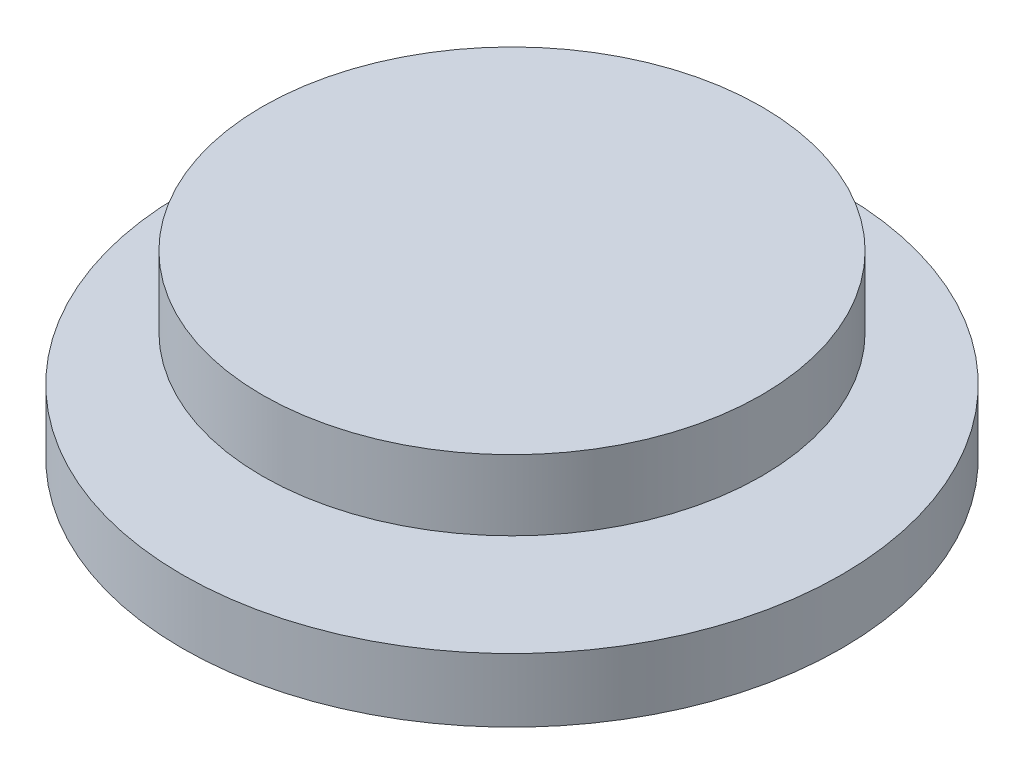
ISO-10303-21;
HEADER;
FILE_DESCRIPTION(('STEP AP214'),'2;1');
FILE_NAME('part.step','',(''),(''),'','','');
FILE_SCHEMA(('AUTOMOTIVE_DESIGN { 1 0 10303 214 1 1 1 1 }'));
ENDSEC;
DATA;
#1=APPLICATION_CONTEXT('core data for automotive mechanical design processes');
#2=APPLICATION_PROTOCOL_DEFINITION('international standard','automotive_design',2000,#1);
#3=PRODUCT_CONTEXT('',#1,'mechanical');
#4=PRODUCT('Part','Part','',(#3));
#5=PRODUCT_RELATED_PRODUCT_CATEGORY('part','',(#4));
#6=PRODUCT_DEFINITION_FORMATION('','',#4);
#7=PRODUCT_DEFINITION_CONTEXT('part definition',#1,'design');
#8=PRODUCT_DEFINITION('design','',#6,#7);
#9=PRODUCT_DEFINITION_SHAPE('','',#8);
#10=(LENGTH_UNIT() NAMED_UNIT(*) SI_UNIT(.MILLI.,.METRE.));
#11=(NAMED_UNIT(*) PLANE_ANGLE_UNIT() SI_UNIT($,.RADIAN.));
#12=(NAMED_UNIT(*) SI_UNIT($,.STERADIAN.) SOLID_ANGLE_UNIT());
#13=UNCERTAINTY_MEASURE_WITH_UNIT(LENGTH_MEASURE(1.E-05),#10,'distance_accuracy_value','');
#14=(GEOMETRIC_REPRESENTATION_CONTEXT(3) GLOBAL_UNCERTAINTY_ASSIGNED_CONTEXT((#13)) GLOBAL_UNIT_ASSIGNED_CONTEXT((#10,
#11,#12)) REPRESENTATION_CONTEXT('',''));
#15=CARTESIAN_POINT('',(0.,0.,0.));
#16=DIRECTION('',(0.,0.,1.));
#17=DIRECTION('',(1.,0.,0.));
#18=AXIS2_PLACEMENT_3D('',#15,#16,#17);
#19=CARTESIAN_POINT('',(0.896279467620914,-31.9712543554007,0.));
#20=DIRECTION('',(0.,-1.,0.));
#21=DIRECTION('',(0.,0.,-1.));
#22=AXIS2_PLACEMENT_3D('',#19,#20,#21);
#23=PLANE('',#22);
#24=CARTESIAN_POINT('',(-28.0659156543303,-31.9712543554007,0.));
#25=DIRECTION('',(0.,-1.,0.));
#26=DIRECTION('',(0.,0.,-1.));
#27=AXIS2_PLACEMENT_3D('',#24,#25,#26);
#28=CIRCLE('',#27,28.9621951219512);
#29=CARTESIAN_POINT('',(-28.0659156543303,-31.9712543554007,-28.9621951219512));
#30=VERTEX_POINT('',#29);
#31=EDGE_CURVE('E76',#30,#30,#28,.T.);
#32=ORIENTED_EDGE('',*,*,#31,.T.);
#33=EDGE_LOOP('',(#32));
#34=FACE_BOUND('',#33,.T.);
#35=ADVANCED_FACE('F43',(#34),#23,.T.);
#36=CARTESIAN_POINT('',(-28.0659156543303,38.4908826945412,0.));
#37=DIRECTION('',(0.,1.,0.));
#38=DIRECTION('',(0.,0.,1.));
#39=AXIS2_PLACEMENT_3D('',#36,#37,#38);
#40=PLANE('',#39);
#41=CARTESIAN_POINT('',(-28.0659156543303,38.4908826945412,0.));
#42=DIRECTION('',(0.,-1.,0.));
#43=DIRECTION('',(0.,0.,-1.));
#44=AXIS2_PLACEMENT_3D('',#41,#42,#43);
#45=CIRCLE('',#44,57.9243902439024);
#46=CARTESIAN_POINT('',(-28.0659156543303,38.4908826945412,-57.9243902439024));
#47=VERTEX_POINT('',#46);
#48=EDGE_CURVE('E10',#47,#47,#45,.T.);
#49=ORIENTED_EDGE('',*,*,#48,.F.);
#50=EDGE_LOOP('',(#49));
#51=FACE_BOUND('',#50,.T.);
#52=ADVANCED_FACE('F96',(#51),#40,.T.);
#53=CARTESIAN_POINT('',(-28.0659156543303,-31.9712543554007,0.));
#54=DIRECTION('',(0.,-1.,0.));
#55=DIRECTION('',(0.,0.,-1.));
#56=AXIS2_PLACEMENT_3D('',#53,#54,#55);
#57=CYLINDRICAL_SURFACE('',#56,57.9243902439024);
#58=ORIENTED_EDGE('',*,*,#48,.T.);
#59=EDGE_LOOP('',(#58));
#60=FACE_BOUND('',#59,.T.);
#61=CARTESIAN_POINT('',(-28.0659156543303,22.1918118466899,0.));
#62=DIRECTION('',(0.,-1.,0.));
#63=DIRECTION('',(0.,0.,-1.));
#64=AXIS2_PLACEMENT_3D('',#61,#62,#63);
#65=CIRCLE('',#64,57.9243902439024);
#66=CARTESIAN_POINT('',(-28.0659156543303,22.1918118466899,-57.9243902439024));
#67=VERTEX_POINT('',#66);
#68=EDGE_CURVE('E49',#67,#67,#65,.T.);
#69=ORIENTED_EDGE('',*,*,#68,.F.);
#70=EDGE_LOOP('',(#69));
#71=FACE_BOUND('',#70,.T.);
#72=ADVANCED_FACE('F99',(#60,#71),#57,.T.);
#73=CARTESIAN_POINT('',(29.8584745895721,22.1918118466899,0.));
#74=DIRECTION('',(0.,-1.,0.));
#75=DIRECTION('',(0.,0.,-1.));
#76=AXIS2_PLACEMENT_3D('',#73,#74,#75);
#77=PLANE('',#76);
#78=ORIENTED_EDGE('',*,*,#68,.T.);
#79=EDGE_LOOP('',(#78));
#80=FACE_BOUND('',#79,.T.);
#81=CARTESIAN_POINT('',(-28.0659156543303,22.1918118466899,0.));
#82=DIRECTION('',(0.,-1.,0.));
#83=DIRECTION('',(0.,0.,-1.));
#84=AXIS2_PLACEMENT_3D('',#81,#82,#83);
#85=CIRCLE('',#84,28.9621951219512);
#86=CARTESIAN_POINT('',(-28.0659156543303,22.1918118466899,-28.9621951219512));
#87=VERTEX_POINT('',#86);
#88=EDGE_CURVE('E54',#87,#87,#85,.T.);
#89=ORIENTED_EDGE('',*,*,#88,.F.);
#90=EDGE_LOOP('',(#89));
#91=FACE_BOUND('',#90,.T.);
#92=ADVANCED_FACE('F103',(#80,#91),#77,.T.);
#93=CARTESIAN_POINT('',(-28.0659156543303,-31.9712543554007,0.));
#94=DIRECTION('',(0.,-1.,0.));
#95=DIRECTION('',(0.,0.,-1.));
#96=AXIS2_PLACEMENT_3D('',#93,#94,#95);
#97=CYLINDRICAL_SURFACE('',#96,28.9621951219512);
#98=ORIENTED_EDGE('',*,*,#88,.T.);
#99=EDGE_LOOP('',(#98));
#100=FACE_BOUND('',#99,.T.);
#101=CARTESIAN_POINT('',(-28.0659156543303,11.6601045296167,0.));
#102=DIRECTION('',(0.,-1.,0.));
#103=DIRECTION('',(0.,0.,-1.));
#104=AXIS2_PLACEMENT_3D('',#101,#102,#103);
#105=CIRCLE('',#104,28.9621951219512);
#106=CARTESIAN_POINT('',(-28.0659156543303,11.6601045296167,-28.9621951219512));
#107=VERTEX_POINT('',#106);
#108=EDGE_CURVE('E58',#107,#107,#105,.T.);
#109=ORIENTED_EDGE('',*,*,#108,.F.);
#110=EDGE_LOOP('',(#109));
#111=FACE_BOUND('',#110,.T.);
#112=ADVANCED_FACE('F110',(#100,#111),#97,.T.);
#113=CARTESIAN_POINT('',(0.896279467620914,11.6601045296167,0.));
#114=DIRECTION('',(0.,1.,0.));
#115=DIRECTION('',(0.,0.,1.));
#116=AXIS2_PLACEMENT_3D('',#113,#114,#115);
#117=PLANE('',#116);
#118=ORIENTED_EDGE('',*,*,#108,.T.);
#119=EDGE_LOOP('',(#118));
#120=FACE_BOUND('',#119,.T.);
#121=CARTESIAN_POINT('',(-28.0659156543303,11.6601045296167,0.));
#122=DIRECTION('',(0.,-1.,0.));
#123=DIRECTION('',(0.,0.,-1.));
#124=AXIS2_PLACEMENT_3D('',#121,#122,#123);
#125=CIRCLE('',#124,76.4802555168409);
#126=CARTESIAN_POINT('',(-28.0659156543303,11.6601045296167,-76.4802555168409));
#127=VERTEX_POINT('',#126);
#128=EDGE_CURVE('E67',#127,#127,#125,.T.);
#129=ORIENTED_EDGE('',*,*,#128,.F.);
#130=EDGE_LOOP('',(#129));
#131=FACE_BOUND('',#130,.T.);
#132=ADVANCED_FACE('F111',(#120,#131),#117,.T.);
#133=CARTESIAN_POINT('',(-28.0659156543303,-31.9712543554007,0.));
#134=DIRECTION('',(0.,-1.,0.));
#135=DIRECTION('',(0.,0.,-1.));
#136=AXIS2_PLACEMENT_3D('',#133,#134,#135);
#137=CYLINDRICAL_SURFACE('',#136,76.4802555168409);
#138=ORIENTED_EDGE('',*,*,#128,.T.);
#139=EDGE_LOOP('',(#138));
#140=FACE_BOUND('',#139,.T.);
#141=CARTESIAN_POINT('',(-28.0659156543303,-3.13443670150987,0.));
#142=DIRECTION('',(0.,-1.,0.));
#143=DIRECTION('',(0.,0.,-1.));
#144=AXIS2_PLACEMENT_3D('',#141,#142,#143);
#145=CIRCLE('',#144,76.4802555168409);
#146=CARTESIAN_POINT('',(-28.0659156543303,-3.13443670150987,-76.4802555168409));
#147=VERTEX_POINT('',#146);
#148=EDGE_CURVE('E68',#147,#147,#145,.T.);
#149=ORIENTED_EDGE('',*,*,#148,.F.);
#150=EDGE_LOOP('',(#149));
#151=FACE_BOUND('',#150,.T.);
#152=ADVANCED_FACE('F95',(#140,#151),#137,.T.);
#153=CARTESIAN_POINT('',(-28.0659156543303,-15.9229384436701,0.));
#154=DIRECTION('',(0.,1.,0.));
#155=DIRECTION('',(0.,0.,1.));
#156=AXIS2_PLACEMENT_3D('',#153,#154,#155);
#157=CONICAL_SURFACE('',#156,28.9621951219512,1.30789622039757);
#158=ORIENTED_EDGE('',*,*,#148,.T.);
#159=EDGE_LOOP('',(#158));
#160=FACE_BOUND('',#159,.T.);
#161=CARTESIAN_POINT('',(-28.0659156543303,-15.9229384436701,0.));
#162=DIRECTION('',(0.,-1.,0.));
#163=DIRECTION('',(0.,0.,-1.));
#164=AXIS2_PLACEMENT_3D('',#161,#162,#163);
#165=CIRCLE('',#164,28.9621951219512);
#166=CARTESIAN_POINT('',(-28.0659156543303,-15.9229384436701,-28.9621951219512));
#167=VERTEX_POINT('',#166);
#168=EDGE_CURVE('E73',#167,#167,#165,.T.);
#169=ORIENTED_EDGE('',*,*,#168,.F.);
#170=EDGE_LOOP('',(#169));
#171=FACE_BOUND('',#170,.T.);
#172=ADVANCED_FACE('F86',(#160,#171),#157,.T.);
#173=CARTESIAN_POINT('',(-28.0659156543303,-31.9712543554007,0.));
#174=DIRECTION('',(0.,-1.,0.));
#175=DIRECTION('',(0.,0.,-1.));
#176=AXIS2_PLACEMENT_3D('',#173,#174,#175);
#177=CYLINDRICAL_SURFACE('',#176,28.9621951219512);
#178=ORIENTED_EDGE('',*,*,#168,.T.);
#179=EDGE_LOOP('',(#178));
#180=FACE_BOUND('',#179,.T.);
#181=ORIENTED_EDGE('',*,*,#31,.F.);
#182=EDGE_LOOP('',(#181));
#183=FACE_BOUND('',#182,.T.);
#184=ADVANCED_FACE('F84',(#180,#183),#177,.T.);
#185=CLOSED_SHELL('',(#35,#52,#72,#92,#112,#132,#152,#172,#184));
#186=MANIFOLD_SOLID_BREP('B2',#185);
#187=ADVANCED_BREP_SHAPE_REPRESENTATION('',(#18,#186),#14);
#188=SHAPE_DEFINITION_REPRESENTATION(#9,#187);
ENDSEC;
END-ISO-10303-21;
